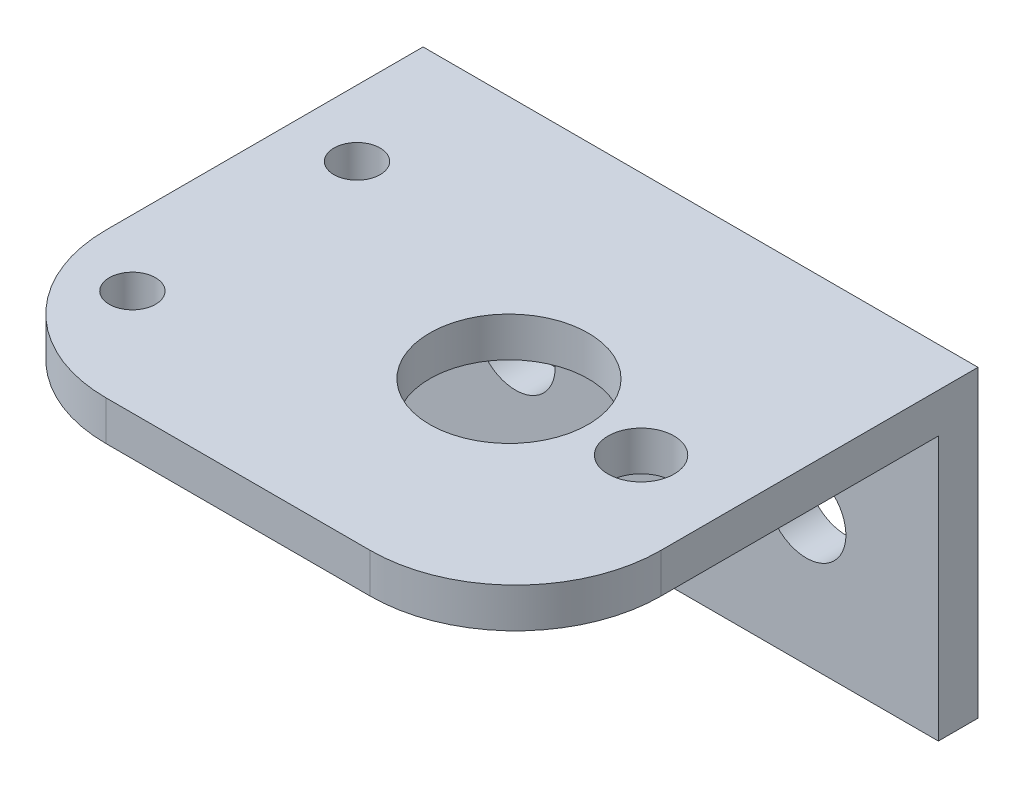
ISO-10303-21;
HEADER;
FILE_DESCRIPTION(('STEP AP214'),'2;1');
FILE_NAME('part.step','',(''),(''),'','','');
FILE_SCHEMA(('AUTOMOTIVE_DESIGN { 1 0 10303 214 1 1 1 1 }'));
ENDSEC;
DATA;
#1=APPLICATION_CONTEXT('core data for automotive mechanical design processes');
#2=APPLICATION_PROTOCOL_DEFINITION('international standard','automotive_design',2000,#1);
#3=PRODUCT_CONTEXT('',#1,'mechanical');
#4=PRODUCT('Part','Part','',(#3));
#5=PRODUCT_RELATED_PRODUCT_CATEGORY('part','',(#4));
#6=PRODUCT_DEFINITION_FORMATION('','',#4);
#7=PRODUCT_DEFINITION_CONTEXT('part definition',#1,'design');
#8=PRODUCT_DEFINITION('design','',#6,#7);
#9=PRODUCT_DEFINITION_SHAPE('','',#8);
#10=(LENGTH_UNIT() NAMED_UNIT(*) SI_UNIT(.MILLI.,.METRE.));
#11=(NAMED_UNIT(*) PLANE_ANGLE_UNIT() SI_UNIT($,.RADIAN.));
#12=(NAMED_UNIT(*) SI_UNIT($,.STERADIAN.) SOLID_ANGLE_UNIT());
#13=UNCERTAINTY_MEASURE_WITH_UNIT(LENGTH_MEASURE(1.E-05),#10,'distance_accuracy_value','');
#14=(GEOMETRIC_REPRESENTATION_CONTEXT(3) GLOBAL_UNCERTAINTY_ASSIGNED_CONTEXT((#13)) GLOBAL_UNIT_ASSIGNED_CONTEXT((#10,
#11,#12)) REPRESENTATION_CONTEXT('',''));
#15=CARTESIAN_POINT('',(0.,0.,0.));
#16=DIRECTION('',(0.,0.,1.));
#17=DIRECTION('',(1.,0.,0.));
#18=AXIS2_PLACEMENT_3D('',#15,#16,#17);
#19=CARTESIAN_POINT('',(0.,0.,0.));
#20=DIRECTION('',(0.,1.,0.));
#21=DIRECTION('',(0.,0.,1.));
#22=AXIS2_PLACEMENT_3D('',#19,#20,#21);
#23=PLANE('',#22);
#24=CARTESIAN_POINT('',(35.,0.,18.5));
#25=DIRECTION('',(0.,1.,0.));
#26=DIRECTION('',(0.,0.,1.));
#27=AXIS2_PLACEMENT_3D('',#24,#25,#26);
#28=CIRCLE('',#27,2.5);
#29=CARTESIAN_POINT('',(35.,0.,21.));
#30=VERTEX_POINT('',#29);
#31=EDGE_CURVE('E139',#30,#30,#28,.T.);
#32=ORIENTED_EDGE('',*,*,#31,.T.);
#33=EDGE_LOOP('',(#32));
#34=FACE_BOUND('',#33,.T.);
#35=CARTESIAN_POINT('',(25.,0.,18.5));
#36=DIRECTION('',(0.,1.,0.));
#37=DIRECTION('',(0.,0.,1.));
#38=AXIS2_PLACEMENT_3D('',#35,#36,#37);
#39=CIRCLE('',#38,6.);
#40=CARTESIAN_POINT('',(25.,0.,24.5));
#41=VERTEX_POINT('',#40);
#42=EDGE_CURVE('E143',#41,#41,#39,.T.);
#43=ORIENTED_EDGE('',*,*,#42,.T.);
#44=EDGE_LOOP('',(#43));
#45=FACE_BOUND('',#44,.T.);
#46=CARTESIAN_POINT('',(5.,0.,27.));
#47=DIRECTION('',(0.,1.,0.));
#48=DIRECTION('',(0.,0.,1.));
#49=AXIS2_PLACEMENT_3D('',#46,#47,#48);
#50=CIRCLE('',#49,1.74999999999998);
#51=CARTESIAN_POINT('',(5.,0.,28.75));
#52=VERTEX_POINT('',#51);
#53=EDGE_CURVE('E149',#52,#52,#50,.T.);
#54=ORIENTED_EDGE('',*,*,#53,.T.);
#55=EDGE_LOOP('',(#54));
#56=FACE_BOUND('',#55,.T.);
#57=CARTESIAN_POINT('',(5.,0.,10.));
#58=DIRECTION('',(0.,1.,0.));
#59=DIRECTION('',(0.,0.,1.));
#60=AXIS2_PLACEMENT_3D('',#57,#58,#59);
#61=CIRCLE('',#60,1.75000000000001);
#62=CARTESIAN_POINT('',(5.,0.,11.75));
#63=VERTEX_POINT('',#62);
#64=EDGE_CURVE('E155',#63,#63,#61,.T.);
#65=ORIENTED_EDGE('',*,*,#64,.T.);
#66=EDGE_LOOP('',(#65));
#67=FACE_BOUND('',#66,.T.);
#68=DIRECTION('',(0.,0.,-1.));
#69=VECTOR('',#68,1.);
#70=CARTESIAN_POINT('',(42.,0.,0.));
#71=LINE('',#70,#69);
#72=CARTESIAN_POINT('',(42.,0.,24.));
#73=VERTEX_POINT('',#72);
#74=CARTESIAN_POINT('',(42.,0.,3.));
#75=VERTEX_POINT('',#74);
#76=EDGE_CURVE('E166',#73,#75,#71,.T.);
#77=ORIENTED_EDGE('',*,*,#76,.F.);
#78=CARTESIAN_POINT('',(31.,0.,24.));
#79=DIRECTION('',(0.,1.,0.));
#80=DIRECTION('',(0.,0.,1.));
#81=AXIS2_PLACEMENT_3D('',#78,#79,#80);
#82=CIRCLE('',#81,11.);
#83=CARTESIAN_POINT('',(31.,0.,35.));
#84=VERTEX_POINT('',#83);
#85=EDGE_CURVE('E187',#73,#84,#82,.F.);
#86=ORIENTED_EDGE('',*,*,#85,.T.);
#87=DIRECTION('',(1.,0.,0.));
#88=VECTOR('',#87,1.);
#89=CARTESIAN_POINT('',(0.,0.,35.));
#90=LINE('',#89,#88);
#91=CARTESIAN_POINT('',(11.,0.,35.));
#92=VERTEX_POINT('',#91);
#93=EDGE_CURVE('E172',#92,#84,#90,.T.);
#94=ORIENTED_EDGE('',*,*,#93,.F.);
#95=CARTESIAN_POINT('',(11.,0.,24.));
#96=DIRECTION('',(0.,1.,0.));
#97=DIRECTION('',(0.,0.,1.));
#98=AXIS2_PLACEMENT_3D('',#95,#96,#97);
#99=CIRCLE('',#98,11.);
#100=CARTESIAN_POINT('',(0.,0.,24.));
#101=VERTEX_POINT('',#100);
#102=EDGE_CURVE('E185',#92,#101,#99,.F.);
#103=ORIENTED_EDGE('',*,*,#102,.T.);
#104=DIRECTION('',(0.,0.,1.));
#105=VECTOR('',#104,1.);
#106=CARTESIAN_POINT('',(0.,0.,0.));
#107=LINE('',#106,#105);
#108=CARTESIAN_POINT('',(0.,0.,3.));
#109=VERTEX_POINT('',#108);
#110=EDGE_CURVE('E161',#109,#101,#107,.T.);
#111=ORIENTED_EDGE('',*,*,#110,.F.);
#112=DIRECTION('',(-1.,0.,0.));
#113=VECTOR('',#112,1.);
#114=CARTESIAN_POINT('',(0.,0.,3.));
#115=LINE('',#114,#113);
#116=EDGE_CURVE('E123',#75,#109,#115,.T.);
#117=ORIENTED_EDGE('',*,*,#116,.F.);
#118=EDGE_LOOP('',(#77,#86,#94,#103,#111,#117));
#119=FACE_BOUND('',#118,.T.);
#120=ADVANCED_FACE('F33',(#34,#45,#56,#67,#119),#23,.F.);
#121=CARTESIAN_POINT('',(0.,3.,0.));
#122=DIRECTION('',(0.,1.,0.));
#123=DIRECTION('',(0.,0.,1.));
#124=AXIS2_PLACEMENT_3D('',#121,#122,#123);
#125=PLANE('',#124);
#126=CARTESIAN_POINT('',(25.,3.,18.5));
#127=DIRECTION('',(0.,1.,0.));
#128=DIRECTION('',(0.,0.,1.));
#129=AXIS2_PLACEMENT_3D('',#126,#127,#128);
#130=CIRCLE('',#129,6.);
#131=CARTESIAN_POINT('',(25.,3.,24.5));
#132=VERTEX_POINT('',#131);
#133=EDGE_CURVE('E146',#132,#132,#130,.T.);
#134=ORIENTED_EDGE('',*,*,#133,.F.);
#135=EDGE_LOOP('',(#134));
#136=FACE_BOUND('',#135,.T.);
#137=CARTESIAN_POINT('',(5.,3.,10.));
#138=DIRECTION('',(0.,1.,0.));
#139=DIRECTION('',(0.,0.,1.));
#140=AXIS2_PLACEMENT_3D('',#137,#138,#139);
#141=CIRCLE('',#140,1.75000000000001);
#142=CARTESIAN_POINT('',(5.,3.,11.75));
#143=VERTEX_POINT('',#142);
#144=EDGE_CURVE('E158',#143,#143,#141,.T.);
#145=ORIENTED_EDGE('',*,*,#144,.F.);
#146=EDGE_LOOP('',(#145));
#147=FACE_BOUND('',#146,.T.);
#148=DIRECTION('',(1.,0.,0.));
#149=VECTOR('',#148,1.);
#150=CARTESIAN_POINT('',(0.,3.,35.));
#151=LINE('',#150,#149);
#152=CARTESIAN_POINT('',(11.,3.,35.));
#153=VERTEX_POINT('',#152);
#154=CARTESIAN_POINT('',(31.,3.,35.));
#155=VERTEX_POINT('',#154);
#156=EDGE_CURVE('E165',#153,#155,#151,.T.);
#157=ORIENTED_EDGE('',*,*,#156,.T.);
#158=CARTESIAN_POINT('',(31.,3.,24.));
#159=DIRECTION('',(0.,1.,0.));
#160=DIRECTION('',(0.,0.,1.));
#161=AXIS2_PLACEMENT_3D('',#158,#159,#160);
#162=CIRCLE('',#161,11.);
#163=CARTESIAN_POINT('',(42.,3.,24.));
#164=VERTEX_POINT('',#163);
#165=EDGE_CURVE('E41',#155,#164,#162,.T.);
#166=ORIENTED_EDGE('',*,*,#165,.T.);
#167=DIRECTION('',(0.,0.,-1.));
#168=VECTOR('',#167,1.);
#169=CARTESIAN_POINT('',(42.,3.,0.));
#170=LINE('',#169,#168);
#171=CARTESIAN_POINT('',(42.,3.,0.));
#172=VERTEX_POINT('',#171);
#173=EDGE_CURVE('E168',#164,#172,#170,.T.);
#174=ORIENTED_EDGE('',*,*,#173,.T.);
#175=DIRECTION('',(-1.,0.,0.));
#176=VECTOR('',#175,1.);
#177=CARTESIAN_POINT('',(0.,3.,0.));
#178=LINE('',#177,#176);
#179=CARTESIAN_POINT('',(0.,3.,0.));
#180=VERTEX_POINT('',#179);
#181=EDGE_CURVE('E109',#172,#180,#178,.T.);
#182=ORIENTED_EDGE('',*,*,#181,.T.);
#183=DIRECTION('',(0.,0.,1.));
#184=VECTOR('',#183,1.);
#185=CARTESIAN_POINT('',(0.,3.,0.));
#186=LINE('',#185,#184);
#187=CARTESIAN_POINT('',(0.,3.,24.));
#188=VERTEX_POINT('',#187);
#189=EDGE_CURVE('E105',#180,#188,#186,.T.);
#190=ORIENTED_EDGE('',*,*,#189,.T.);
#191=CARTESIAN_POINT('',(11.,3.,24.));
#192=DIRECTION('',(0.,1.,0.));
#193=DIRECTION('',(0.,0.,1.));
#194=AXIS2_PLACEMENT_3D('',#191,#192,#193);
#195=CIRCLE('',#194,11.);
#196=EDGE_CURVE('E193',#188,#153,#195,.T.);
#197=ORIENTED_EDGE('',*,*,#196,.T.);
#198=EDGE_LOOP('',(#157,#166,#174,#182,#190,#197));
#199=FACE_BOUND('',#198,.T.);
#200=CARTESIAN_POINT('',(5.,3.,27.));
#201=DIRECTION('',(0.,1.,0.));
#202=DIRECTION('',(0.,0.,1.));
#203=AXIS2_PLACEMENT_3D('',#200,#201,#202);
#204=CIRCLE('',#203,1.74999999999998);
#205=CARTESIAN_POINT('',(5.,3.,28.75));
#206=VERTEX_POINT('',#205);
#207=EDGE_CURVE('E152',#206,#206,#204,.T.);
#208=ORIENTED_EDGE('',*,*,#207,.F.);
#209=EDGE_LOOP('',(#208));
#210=FACE_BOUND('',#209,.T.);
#211=CARTESIAN_POINT('',(35.,3.,18.5));
#212=DIRECTION('',(0.,1.,0.));
#213=DIRECTION('',(0.,0.,1.));
#214=AXIS2_PLACEMENT_3D('',#211,#212,#213);
#215=CIRCLE('',#214,2.5);
#216=CARTESIAN_POINT('',(35.,3.,21.));
#217=VERTEX_POINT('',#216);
#218=EDGE_CURVE('E140',#217,#217,#215,.T.);
#219=ORIENTED_EDGE('',*,*,#218,.F.);
#220=EDGE_LOOP('',(#219));
#221=FACE_BOUND('',#220,.T.);
#222=ADVANCED_FACE('F197',(#136,#147,#199,#210,#221),#125,.T.);
#223=CARTESIAN_POINT('',(0.,3.,0.));
#224=DIRECTION('',(1.,0.,0.));
#225=DIRECTION('',(0.,0.,-1.));
#226=AXIS2_PLACEMENT_3D('',#223,#224,#225);
#227=PLANE('',#226);
#228=ORIENTED_EDGE('',*,*,#110,.T.);
#229=DIRECTION('',(0.,-1.,0.));
#230=VECTOR('',#229,1.);
#231=CARTESIAN_POINT('',(0.,3.,24.));
#232=LINE('',#231,#230);
#233=EDGE_CURVE('E11',#101,#188,#232,.F.);
#234=ORIENTED_EDGE('',*,*,#233,.T.);
#235=ORIENTED_EDGE('',*,*,#189,.F.);
#236=DIRECTION('',(0.,-1.,0.));
#237=VECTOR('',#236,1.);
#238=CARTESIAN_POINT('',(0.,3.,0.));
#239=LINE('',#238,#237);
#240=CARTESIAN_POINT('',(0.,-20.,0.));
#241=VERTEX_POINT('',#240);
#242=EDGE_CURVE('E99',#180,#241,#239,.T.);
#243=ORIENTED_EDGE('',*,*,#242,.T.);
#244=DIRECTION('',(0.,0.,-1.));
#245=VECTOR('',#244,1.);
#246=CARTESIAN_POINT('',(0.,-20.,0.));
#247=LINE('',#246,#245);
#248=CARTESIAN_POINT('',(0.,-20.,3.));
#249=VERTEX_POINT('',#248);
#250=EDGE_CURVE('E104',#249,#241,#247,.T.);
#251=ORIENTED_EDGE('',*,*,#250,.F.);
#252=DIRECTION('',(0.,1.,0.));
#253=VECTOR('',#252,1.);
#254=CARTESIAN_POINT('',(0.,-20.,3.));
#255=LINE('',#254,#253);
#256=EDGE_CURVE('E133',#249,#109,#255,.T.);
#257=ORIENTED_EDGE('',*,*,#256,.T.);
#258=EDGE_LOOP('',(#228,#234,#235,#243,#251,#257));
#259=FACE_BOUND('',#258,.T.);
#260=ADVANCED_FACE('F101',(#259),#227,.F.);
#261=CARTESIAN_POINT('',(0.,3.,35.));
#262=DIRECTION('',(0.,0.,-1.));
#263=DIRECTION('',(-1.,0.,0.));
#264=AXIS2_PLACEMENT_3D('',#261,#262,#263);
#265=PLANE('',#264);
#266=ORIENTED_EDGE('',*,*,#93,.T.);
#267=DIRECTION('',(0.,-1.,0.));
#268=VECTOR('',#267,1.);
#269=CARTESIAN_POINT('',(31.,3.,35.));
#270=LINE('',#269,#268);
#271=EDGE_CURVE('E54',#84,#155,#270,.F.);
#272=ORIENTED_EDGE('',*,*,#271,.T.);
#273=ORIENTED_EDGE('',*,*,#156,.F.);
#274=DIRECTION('',(0.,-1.,0.));
#275=VECTOR('',#274,1.);
#276=CARTESIAN_POINT('',(11.,3.,35.));
#277=LINE('',#276,#275);
#278=EDGE_CURVE('E189',#153,#92,#277,.T.);
#279=ORIENTED_EDGE('',*,*,#278,.T.);
#280=EDGE_LOOP('',(#266,#272,#273,#279));
#281=FACE_BOUND('',#280,.T.);
#282=ADVANCED_FACE('F208',(#281),#265,.F.);
#283=CARTESIAN_POINT('',(42.,3.,0.));
#284=DIRECTION('',(-1.,0.,0.));
#285=DIRECTION('',(0.,0.,1.));
#286=AXIS2_PLACEMENT_3D('',#283,#284,#285);
#287=PLANE('',#286);
#288=ORIENTED_EDGE('',*,*,#173,.F.);
#289=DIRECTION('',(0.,-1.,0.));
#290=VECTOR('',#289,1.);
#291=CARTESIAN_POINT('',(42.,3.,24.));
#292=LINE('',#291,#290);
#293=EDGE_CURVE('E176',#164,#73,#292,.T.);
#294=ORIENTED_EDGE('',*,*,#293,.T.);
#295=ORIENTED_EDGE('',*,*,#76,.T.);
#296=DIRECTION('',(0.,1.,0.));
#297=VECTOR('',#296,1.);
#298=CARTESIAN_POINT('',(42.,-20.,3.));
#299=LINE('',#298,#297);
#300=CARTESIAN_POINT('',(42.,-20.,3.));
#301=VERTEX_POINT('',#300);
#302=EDGE_CURVE('E136',#301,#75,#299,.T.);
#303=ORIENTED_EDGE('',*,*,#302,.F.);
#304=DIRECTION('',(0.,0.,1.));
#305=VECTOR('',#304,1.);
#306=CARTESIAN_POINT('',(42.,-20.,0.));
#307=LINE('',#306,#305);
#308=CARTESIAN_POINT('',(42.,-20.,0.));
#309=VERTEX_POINT('',#308);
#310=EDGE_CURVE('E117',#309,#301,#307,.T.);
#311=ORIENTED_EDGE('',*,*,#310,.F.);
#312=DIRECTION('',(0.,-1.,0.));
#313=VECTOR('',#312,1.);
#314=CARTESIAN_POINT('',(42.,3.,0.));
#315=LINE('',#314,#313);
#316=EDGE_CURVE('E108',#172,#309,#315,.T.);
#317=ORIENTED_EDGE('',*,*,#316,.F.);
#318=EDGE_LOOP('',(#288,#294,#295,#303,#311,#317));
#319=FACE_BOUND('',#318,.T.);
#320=ADVANCED_FACE('F202',(#319),#287,.F.);
#321=CARTESIAN_POINT('',(0.,3.,0.));
#322=DIRECTION('',(0.,0.,1.));
#323=DIRECTION('',(1.,0.,0.));
#324=AXIS2_PLACEMENT_3D('',#321,#322,#323);
#325=PLANE('',#324);
#326=CARTESIAN_POINT('',(32.,-10.,0.));
#327=DIRECTION('',(0.,0.,-1.));
#328=DIRECTION('',(-1.,0.,0.));
#329=AXIS2_PLACEMENT_3D('',#326,#327,#328);
#330=CIRCLE('',#329,3.);
#331=CARTESIAN_POINT('',(29.,-10.,0.));
#332=VERTEX_POINT('',#331);
#333=EDGE_CURVE('E180',#332,#332,#330,.T.);
#334=ORIENTED_EDGE('',*,*,#333,.F.);
#335=EDGE_LOOP('',(#334));
#336=FACE_BOUND('',#335,.T.);
#337=CARTESIAN_POINT('',(10.,-9.99999999999999,0.));
#338=DIRECTION('',(0.,0.,-1.));
#339=DIRECTION('',(-1.,0.,0.));
#340=AXIS2_PLACEMENT_3D('',#337,#338,#339);
#341=CIRCLE('',#340,3.);
#342=CARTESIAN_POINT('',(7.,-9.99999999999999,0.));
#343=VERTEX_POINT('',#342);
#344=EDGE_CURVE('E129',#343,#343,#341,.T.);
#345=ORIENTED_EDGE('',*,*,#344,.F.);
#346=EDGE_LOOP('',(#345));
#347=FACE_BOUND('',#346,.T.);
#348=ORIENTED_EDGE('',*,*,#316,.T.);
#349=DIRECTION('',(1.,0.,0.));
#350=VECTOR('',#349,1.);
#351=CARTESIAN_POINT('',(0.,-20.,0.));
#352=LINE('',#351,#350);
#353=EDGE_CURVE('E112',#241,#309,#352,.T.);
#354=ORIENTED_EDGE('',*,*,#353,.F.);
#355=ORIENTED_EDGE('',*,*,#242,.F.);
#356=ORIENTED_EDGE('',*,*,#181,.F.);
#357=EDGE_LOOP('',(#348,#354,#355,#356));
#358=FACE_BOUND('',#357,.T.);
#359=ADVANCED_FACE('F113',(#336,#347,#358),#325,.F.);
#360=CARTESIAN_POINT('',(5.,3.,10.));
#361=DIRECTION('',(0.,-1.,0.));
#362=DIRECTION('',(0.,0.,-1.));
#363=AXIS2_PLACEMENT_3D('',#360,#361,#362);
#364=CYLINDRICAL_SURFACE('',#363,1.75000000000001);
#365=ORIENTED_EDGE('',*,*,#144,.T.);
#366=EDGE_LOOP('',(#365));
#367=FACE_BOUND('',#366,.T.);
#368=ORIENTED_EDGE('',*,*,#64,.F.);
#369=EDGE_LOOP('',(#368));
#370=FACE_BOUND('',#369,.T.);
#371=ADVANCED_FACE('F242',(#367,#370),#364,.F.);
#372=CARTESIAN_POINT('',(5.,3.,27.));
#373=DIRECTION('',(0.,-1.,0.));
#374=DIRECTION('',(0.,0.,-1.));
#375=AXIS2_PLACEMENT_3D('',#372,#373,#374);
#376=CYLINDRICAL_SURFACE('',#375,1.74999999999998);
#377=ORIENTED_EDGE('',*,*,#207,.T.);
#378=EDGE_LOOP('',(#377));
#379=FACE_BOUND('',#378,.T.);
#380=ORIENTED_EDGE('',*,*,#53,.F.);
#381=EDGE_LOOP('',(#380));
#382=FACE_BOUND('',#381,.T.);
#383=ADVANCED_FACE('F303',(#379,#382),#376,.F.);
#384=CARTESIAN_POINT('',(25.,3.,18.5));
#385=DIRECTION('',(0.,-1.,0.));
#386=DIRECTION('',(0.,0.,-1.));
#387=AXIS2_PLACEMENT_3D('',#384,#385,#386);
#388=CYLINDRICAL_SURFACE('',#387,6.);
#389=ORIENTED_EDGE('',*,*,#133,.T.);
#390=EDGE_LOOP('',(#389));
#391=FACE_BOUND('',#390,.T.);
#392=ORIENTED_EDGE('',*,*,#42,.F.);
#393=EDGE_LOOP('',(#392));
#394=FACE_BOUND('',#393,.T.);
#395=ADVANCED_FACE('F225',(#391,#394),#388,.F.);
#396=CARTESIAN_POINT('',(35.,3.,18.5));
#397=DIRECTION('',(0.,-1.,0.));
#398=DIRECTION('',(0.,0.,-1.));
#399=AXIS2_PLACEMENT_3D('',#396,#397,#398);
#400=CYLINDRICAL_SURFACE('',#399,2.5);
#401=ORIENTED_EDGE('',*,*,#218,.T.);
#402=EDGE_LOOP('',(#401));
#403=FACE_BOUND('',#402,.T.);
#404=ORIENTED_EDGE('',*,*,#31,.F.);
#405=EDGE_LOOP('',(#404));
#406=FACE_BOUND('',#405,.T.);
#407=ADVANCED_FACE('F216',(#403,#406),#400,.F.);
#408=CARTESIAN_POINT('',(0.,-20.,3.));
#409=DIRECTION('',(0.,0.,-1.));
#410=DIRECTION('',(-1.,0.,0.));
#411=AXIS2_PLACEMENT_3D('',#408,#409,#410);
#412=PLANE('',#411);
#413=CARTESIAN_POINT('',(32.,-10.,3.));
#414=DIRECTION('',(0.,0.,-1.));
#415=DIRECTION('',(-1.,0.,0.));
#416=AXIS2_PLACEMENT_3D('',#413,#414,#415);
#417=CIRCLE('',#416,3.);
#418=CARTESIAN_POINT('',(29.,-10.,3.));
#419=VERTEX_POINT('',#418);
#420=EDGE_CURVE('E126',#419,#419,#417,.T.);
#421=ORIENTED_EDGE('',*,*,#420,.T.);
#422=EDGE_LOOP('',(#421));
#423=FACE_BOUND('',#422,.T.);
#424=CARTESIAN_POINT('',(10.,-9.99999999999999,3.));
#425=DIRECTION('',(0.,0.,-1.));
#426=DIRECTION('',(-1.,0.,0.));
#427=AXIS2_PLACEMENT_3D('',#424,#425,#426);
#428=CIRCLE('',#427,3.);
#429=CARTESIAN_POINT('',(7.,-9.99999999999999,3.));
#430=VERTEX_POINT('',#429);
#431=EDGE_CURVE('E177',#430,#430,#428,.T.);
#432=ORIENTED_EDGE('',*,*,#431,.T.);
#433=EDGE_LOOP('',(#432));
#434=FACE_BOUND('',#433,.T.);
#435=ORIENTED_EDGE('',*,*,#116,.T.);
#436=ORIENTED_EDGE('',*,*,#256,.F.);
#437=DIRECTION('',(-1.,0.,0.));
#438=VECTOR('',#437,1.);
#439=CARTESIAN_POINT('',(0.,-20.,3.));
#440=LINE('',#439,#438);
#441=EDGE_CURVE('E121',#301,#249,#440,.T.);
#442=ORIENTED_EDGE('',*,*,#441,.F.);
#443=ORIENTED_EDGE('',*,*,#302,.T.);
#444=EDGE_LOOP('',(#435,#436,#442,#443));
#445=FACE_BOUND('',#444,.T.);
#446=ADVANCED_FACE('F213',(#423,#434,#445),#412,.F.);
#447=CARTESIAN_POINT('',(0.,-20.,0.));
#448=DIRECTION('',(0.,1.,0.));
#449=DIRECTION('',(0.,0.,1.));
#450=AXIS2_PLACEMENT_3D('',#447,#448,#449);
#451=PLANE('',#450);
#452=ORIENTED_EDGE('',*,*,#250,.T.);
#453=ORIENTED_EDGE('',*,*,#353,.T.);
#454=ORIENTED_EDGE('',*,*,#310,.T.);
#455=ORIENTED_EDGE('',*,*,#441,.T.);
#456=EDGE_LOOP('',(#452,#453,#454,#455));
#457=FACE_BOUND('',#456,.T.);
#458=ADVANCED_FACE('F119',(#457),#451,.F.);
#459=CARTESIAN_POINT('',(10.,-9.99999999999999,20.));
#460=DIRECTION('',(0.,0.,-1.));
#461=DIRECTION('',(-1.,0.,0.));
#462=AXIS2_PLACEMENT_3D('',#459,#460,#461);
#463=CYLINDRICAL_SURFACE('',#462,3.);
#464=ORIENTED_EDGE('',*,*,#344,.T.);
#465=EDGE_LOOP('',(#464));
#466=FACE_BOUND('',#465,.T.);
#467=ORIENTED_EDGE('',*,*,#431,.F.);
#468=EDGE_LOOP('',(#467));
#469=FACE_BOUND('',#468,.T.);
#470=ADVANCED_FACE('F223',(#466,#469),#463,.F.);
#471=CARTESIAN_POINT('',(32.,-10.,20.));
#472=DIRECTION('',(0.,0.,-1.));
#473=DIRECTION('',(-1.,0.,0.));
#474=AXIS2_PLACEMENT_3D('',#471,#472,#473);
#475=CYLINDRICAL_SURFACE('',#474,3.);
#476=ORIENTED_EDGE('',*,*,#333,.T.);
#477=EDGE_LOOP('',(#476));
#478=FACE_BOUND('',#477,.T.);
#479=ORIENTED_EDGE('',*,*,#420,.F.);
#480=EDGE_LOOP('',(#479));
#481=FACE_BOUND('',#480,.T.);
#482=ADVANCED_FACE('F250',(#478,#481),#475,.F.);
#483=CARTESIAN_POINT('',(31.,3.,24.));
#484=DIRECTION('',(0.,-1.,0.));
#485=DIRECTION('',(0.,0.,-1.));
#486=AXIS2_PLACEMENT_3D('',#483,#484,#485);
#487=CYLINDRICAL_SURFACE('',#486,11.);
#488=ORIENTED_EDGE('',*,*,#165,.F.);
#489=ORIENTED_EDGE('',*,*,#271,.F.);
#490=ORIENTED_EDGE('',*,*,#85,.F.);
#491=ORIENTED_EDGE('',*,*,#293,.F.);
#492=EDGE_LOOP('',(#488,#489,#490,#491));
#493=FACE_BOUND('',#492,.T.);
#494=ADVANCED_FACE('F204',(#493),#487,.T.);
#495=CARTESIAN_POINT('',(11.,3.,24.));
#496=DIRECTION('',(0.,-1.,0.));
#497=DIRECTION('',(0.,0.,-1.));
#498=AXIS2_PLACEMENT_3D('',#495,#496,#497);
#499=CYLINDRICAL_SURFACE('',#498,11.);
#500=ORIENTED_EDGE('',*,*,#196,.F.);
#501=ORIENTED_EDGE('',*,*,#233,.F.);
#502=ORIENTED_EDGE('',*,*,#102,.F.);
#503=ORIENTED_EDGE('',*,*,#278,.F.);
#504=EDGE_LOOP('',(#500,#501,#502,#503));
#505=FACE_BOUND('',#504,.T.);
#506=ADVANCED_FACE('F35',(#505),#499,.T.);
#507=CLOSED_SHELL('',(#120,#222,#260,#282,#320,#359,#371,#383,#395,#407,#446,#458,#470,#482,
#494,#506));
#508=MANIFOLD_SOLID_BREP('B2',#507);
#509=ADVANCED_BREP_SHAPE_REPRESENTATION('',(#18,#508),#14);
#510=SHAPE_DEFINITION_REPRESENTATION(#9,#509);
ENDSEC;
END-ISO-10303-21;
